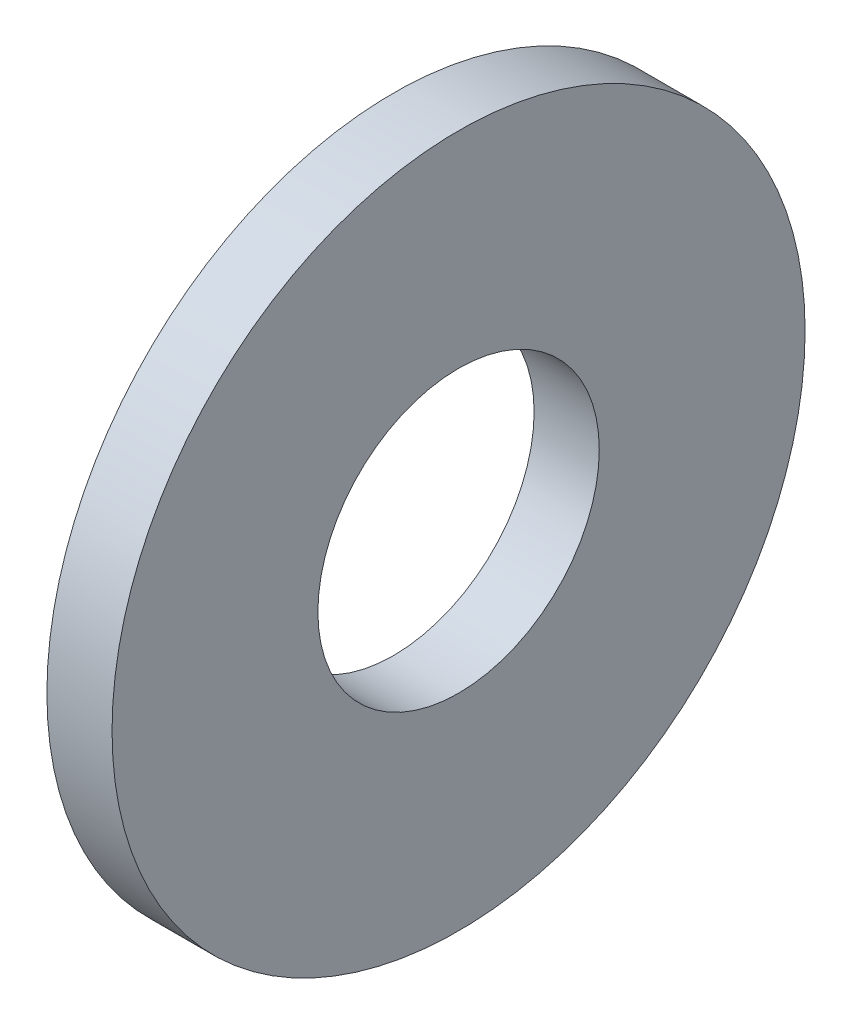
ISO-10303-21;
HEADER;
FILE_DESCRIPTION(('STEP AP214'),'2;1');
FILE_NAME('part.step','',(''),(''),'','','');
FILE_SCHEMA(('AUTOMOTIVE_DESIGN { 1 0 10303 214 1 1 1 1 }'));
ENDSEC;
DATA;
#1=APPLICATION_CONTEXT('core data for automotive mechanical design processes');
#2=APPLICATION_PROTOCOL_DEFINITION('international standard','automotive_design',2000,#1);
#3=PRODUCT_CONTEXT('',#1,'mechanical');
#4=PRODUCT('Part','Part','',(#3));
#5=PRODUCT_RELATED_PRODUCT_CATEGORY('part','',(#4));
#6=PRODUCT_DEFINITION_FORMATION('','',#4);
#7=PRODUCT_DEFINITION_CONTEXT('part definition',#1,'design');
#8=PRODUCT_DEFINITION('design','',#6,#7);
#9=PRODUCT_DEFINITION_SHAPE('','',#8);
#10=(LENGTH_UNIT() NAMED_UNIT(*) SI_UNIT(.MILLI.,.METRE.));
#11=(NAMED_UNIT(*) PLANE_ANGLE_UNIT() SI_UNIT($,.RADIAN.));
#12=(NAMED_UNIT(*) SI_UNIT($,.STERADIAN.) SOLID_ANGLE_UNIT());
#13=UNCERTAINTY_MEASURE_WITH_UNIT(LENGTH_MEASURE(1.E-05),#10,'distance_accuracy_value','');
#14=(GEOMETRIC_REPRESENTATION_CONTEXT(3) GLOBAL_UNCERTAINTY_ASSIGNED_CONTEXT((#13)) GLOBAL_UNIT_ASSIGNED_CONTEXT((#10,
#11,#12)) REPRESENTATION_CONTEXT('',''));
#15=CARTESIAN_POINT('',(0.,0.,0.));
#16=DIRECTION('',(0.,0.,1.));
#17=DIRECTION('',(1.,0.,0.));
#18=AXIS2_PLACEMENT_3D('',#15,#16,#17);
#19=CARTESIAN_POINT('',(1.1938,0.,0.));
#20=DIRECTION('',(1.,0.,0.));
#21=DIRECTION('',(0.,0.,-1.));
#22=AXIS2_PLACEMENT_3D('',#19,#20,#21);
#23=PLANE('',#22);
#24=CARTESIAN_POINT('',(1.1938,0.,0.));
#25=DIRECTION('',(1.,0.,0.));
#26=DIRECTION('',(0.,0.,-1.));
#27=AXIS2_PLACEMENT_3D('',#24,#25,#26);
#28=CIRCLE('',#27,6.35);
#29=CARTESIAN_POINT('',(1.1938,0.,-6.35));
#30=VERTEX_POINT('',#29);
#31=EDGE_CURVE('E10',#30,#30,#28,.T.);
#32=ORIENTED_EDGE('',*,*,#31,.T.);
#33=EDGE_LOOP('',(#32));
#34=FACE_BOUND('',#33,.T.);
#35=CARTESIAN_POINT('',(1.1938,0.,0.));
#36=DIRECTION('',(1.,0.,0.));
#37=DIRECTION('',(0.,0.,-1.));
#38=AXIS2_PLACEMENT_3D('',#35,#36,#37);
#39=CIRCLE('',#38,2.5781);
#40=CARTESIAN_POINT('',(1.1938,0.,-2.5781));
#41=VERTEX_POINT('',#40);
#42=EDGE_CURVE('E42',#41,#41,#39,.T.);
#43=ORIENTED_EDGE('',*,*,#42,.F.);
#44=EDGE_LOOP('',(#43));
#45=FACE_BOUND('',#44,.T.);
#46=ADVANCED_FACE('F31',(#34,#45),#23,.T.);
#47=CARTESIAN_POINT('',(0.,0.,0.));
#48=DIRECTION('',(1.,0.,0.));
#49=DIRECTION('',(0.,0.,-1.));
#50=AXIS2_PLACEMENT_3D('',#47,#48,#49);
#51=PLANE('',#50);
#52=CARTESIAN_POINT('',(0.,0.,0.));
#53=DIRECTION('',(1.,0.,0.));
#54=DIRECTION('',(0.,0.,-1.));
#55=AXIS2_PLACEMENT_3D('',#52,#53,#54);
#56=CIRCLE('',#55,6.35);
#57=CARTESIAN_POINT('',(0.,0.,-6.35));
#58=VERTEX_POINT('',#57);
#59=EDGE_CURVE('E35',#58,#58,#56,.T.);
#60=ORIENTED_EDGE('',*,*,#59,.F.);
#61=EDGE_LOOP('',(#60));
#62=FACE_BOUND('',#61,.T.);
#63=CARTESIAN_POINT('',(0.,0.,0.));
#64=DIRECTION('',(1.,0.,0.));
#65=DIRECTION('',(0.,0.,-1.));
#66=AXIS2_PLACEMENT_3D('',#63,#64,#65);
#67=CIRCLE('',#66,2.5781);
#68=CARTESIAN_POINT('',(0.,0.,-2.5781));
#69=VERTEX_POINT('',#68);
#70=EDGE_CURVE('E44',#69,#69,#67,.T.);
#71=ORIENTED_EDGE('',*,*,#70,.T.);
#72=EDGE_LOOP('',(#71));
#73=FACE_BOUND('',#72,.T.);
#74=ADVANCED_FACE('F54',(#62,#73),#51,.F.);
#75=CARTESIAN_POINT('',(1.1938,0.,0.));
#76=DIRECTION('',(-1.,0.,0.));
#77=DIRECTION('',(0.,0.,1.));
#78=AXIS2_PLACEMENT_3D('',#75,#76,#77);
#79=CYLINDRICAL_SURFACE('',#78,6.35);
#80=ORIENTED_EDGE('',*,*,#31,.F.);
#81=EDGE_LOOP('',(#80));
#82=FACE_BOUND('',#81,.T.);
#83=ORIENTED_EDGE('',*,*,#59,.T.);
#84=EDGE_LOOP('',(#83));
#85=FACE_BOUND('',#84,.T.);
#86=ADVANCED_FACE('F33',(#82,#85),#79,.T.);
#87=CARTESIAN_POINT('',(1.1938,0.,0.));
#88=DIRECTION('',(-1.,0.,0.));
#89=DIRECTION('',(0.,0.,1.));
#90=AXIS2_PLACEMENT_3D('',#87,#88,#89);
#91=CYLINDRICAL_SURFACE('',#90,2.5781);
#92=ORIENTED_EDGE('',*,*,#42,.T.);
#93=EDGE_LOOP('',(#92));
#94=FACE_BOUND('',#93,.T.);
#95=ORIENTED_EDGE('',*,*,#70,.F.);
#96=EDGE_LOOP('',(#95));
#97=FACE_BOUND('',#96,.T.);
#98=ADVANCED_FACE('F50',(#94,#97),#91,.F.);
#99=CLOSED_SHELL('',(#46,#74,#86,#98));
#100=MANIFOLD_SOLID_BREP('B2',#99);
#101=ADVANCED_BREP_SHAPE_REPRESENTATION('',(#18,#100),#14);
#102=SHAPE_DEFINITION_REPRESENTATION(#9,#101);
ENDSEC;
END-ISO-10303-21;
